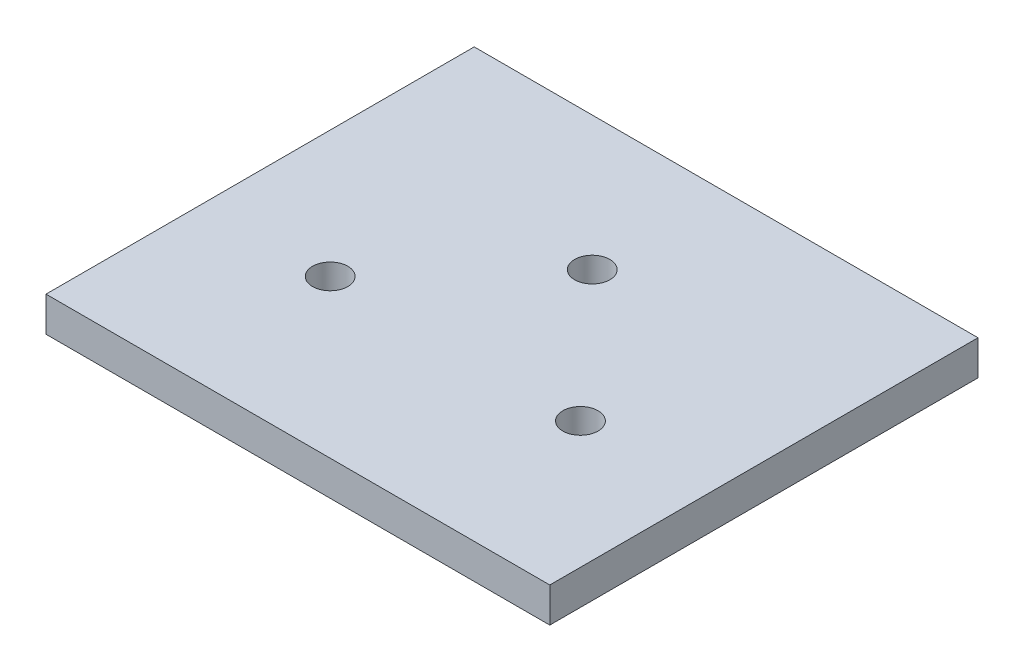
ISO-10303-21;
HEADER;
FILE_DESCRIPTION(('STEP AP214'),'2;1');
FILE_NAME('part.step','',(''),(''),'','','');
FILE_SCHEMA(('AUTOMOTIVE_DESIGN { 1 0 10303 214 1 1 1 1 }'));
ENDSEC;
DATA;
#1=APPLICATION_CONTEXT('core data for automotive mechanical design processes');
#2=APPLICATION_PROTOCOL_DEFINITION('international standard','automotive_design',2000,#1);
#3=PRODUCT_CONTEXT('',#1,'mechanical');
#4=PRODUCT('Part','Part','',(#3));
#5=PRODUCT_RELATED_PRODUCT_CATEGORY('part','',(#4));
#6=PRODUCT_DEFINITION_FORMATION('','',#4);
#7=PRODUCT_DEFINITION_CONTEXT('part definition',#1,'design');
#8=PRODUCT_DEFINITION('design','',#6,#7);
#9=PRODUCT_DEFINITION_SHAPE('','',#8);
#10=(LENGTH_UNIT() NAMED_UNIT(*) SI_UNIT(.MILLI.,.METRE.));
#11=(NAMED_UNIT(*) PLANE_ANGLE_UNIT() SI_UNIT($,.RADIAN.));
#12=(NAMED_UNIT(*) SI_UNIT($,.STERADIAN.) SOLID_ANGLE_UNIT());
#13=UNCERTAINTY_MEASURE_WITH_UNIT(LENGTH_MEASURE(1.E-05),#10,'distance_accuracy_value','');
#14=(GEOMETRIC_REPRESENTATION_CONTEXT(3) GLOBAL_UNCERTAINTY_ASSIGNED_CONTEXT((#13)) GLOBAL_UNIT_ASSIGNED_CONTEXT((#10,
#11,#12)) REPRESENTATION_CONTEXT('',''));
#15=CARTESIAN_POINT('',(0.,0.,0.));
#16=DIRECTION('',(0.,0.,1.));
#17=DIRECTION('',(1.,0.,0.));
#18=AXIS2_PLACEMENT_3D('',#15,#16,#17);
#19=CARTESIAN_POINT('',(0.,6.9,0.));
#20=DIRECTION('',(0.,-1.,0.));
#21=DIRECTION('',(0.,0.,-1.));
#22=AXIS2_PLACEMENT_3D('',#19,#20,#21);
#23=PLANE('',#22);
#24=DIRECTION('',(0.,0.,1.));
#25=VECTOR('',#24,1.);
#26=CARTESIAN_POINT('',(-50.,6.9,0.));
#27=LINE('',#26,#25);
#28=CARTESIAN_POINT('',(-50.,6.9,-85.));
#29=VERTEX_POINT('',#28);
#30=CARTESIAN_POINT('',(-50.,6.9,0.));
#31=VERTEX_POINT('',#30);
#32=EDGE_CURVE('E98',#29,#31,#27,.T.);
#33=ORIENTED_EDGE('',*,*,#32,.T.);
#34=DIRECTION('',(1.,0.,0.));
#35=VECTOR('',#34,1.);
#36=CARTESIAN_POINT('',(50.,6.9,0.));
#37=LINE('',#36,#35);
#38=CARTESIAN_POINT('',(50.,6.9,0.));
#39=VERTEX_POINT('',#38);
#40=EDGE_CURVE('E93',#31,#39,#37,.T.);
#41=ORIENTED_EDGE('',*,*,#40,.T.);
#42=DIRECTION('',(0.,0.,-1.));
#43=VECTOR('',#42,1.);
#44=CARTESIAN_POINT('',(50.,6.9,0.));
#45=LINE('',#44,#43);
#46=CARTESIAN_POINT('',(50.,6.9,-85.));
#47=VERTEX_POINT('',#46);
#48=EDGE_CURVE('E96',#39,#47,#45,.T.);
#49=ORIENTED_EDGE('',*,*,#48,.T.);
#50=DIRECTION('',(-1.,0.,0.));
#51=VECTOR('',#50,1.);
#52=CARTESIAN_POINT('',(-50.,6.9,-85.));
#53=LINE('',#52,#51);
#54=EDGE_CURVE('E63',#47,#29,#53,.T.);
#55=ORIENTED_EDGE('',*,*,#54,.T.);
#56=EDGE_LOOP('',(#33,#41,#49,#55));
#57=FACE_BOUND('',#56,.T.);
#58=CARTESIAN_POINT('',(0.,6.9,-58.4291717063436));
#59=DIRECTION('',(0.,1.,0.));
#60=DIRECTION('',(0.,0.,1.));
#61=AXIS2_PLACEMENT_3D('',#58,#59,#60);
#62=CIRCLE('',#61,3.5);
#63=CARTESIAN_POINT('',(0.,6.9,-61.9291717063436));
#64=VERTEX_POINT('',#63);
#65=EDGE_CURVE('E118',#64,#64,#62,.T.);
#66=ORIENTED_EDGE('',*,*,#65,.F.);
#67=EDGE_LOOP('',(#66));
#68=FACE_BOUND('',#67,.T.);
#69=CARTESIAN_POINT('',(24.8395858531718,6.9,-31.25));
#70=DIRECTION('',(0.,1.,0.));
#71=DIRECTION('',(0.,0.,1.));
#72=AXIS2_PLACEMENT_3D('',#69,#70,#71);
#73=CIRCLE('',#72,3.5);
#74=CARTESIAN_POINT('',(24.8395858531718,6.9,-34.75));
#75=VERTEX_POINT('',#74);
#76=EDGE_CURVE('E140',#75,#75,#73,.T.);
#77=ORIENTED_EDGE('',*,*,#76,.F.);
#78=EDGE_LOOP('',(#77));
#79=FACE_BOUND('',#78,.T.);
#80=CARTESIAN_POINT('',(-24.8395858531718,6.9,-31.25));
#81=DIRECTION('',(0.,1.,0.));
#82=DIRECTION('',(0.,0.,1.));
#83=AXIS2_PLACEMENT_3D('',#80,#81,#82);
#84=CIRCLE('',#83,3.5);
#85=CARTESIAN_POINT('',(-24.8395858531718,6.9,-34.75));
#86=VERTEX_POINT('',#85);
#87=EDGE_CURVE('E148',#86,#86,#84,.T.);
#88=ORIENTED_EDGE('',*,*,#87,.F.);
#89=EDGE_LOOP('',(#88));
#90=FACE_BOUND('',#89,.T.);
#91=ADVANCED_FACE('F45',(#57,#68,#79,#90),#23,.F.);
#92=CARTESIAN_POINT('',(0.,0.,0.));
#93=DIRECTION('',(0.,-1.,0.));
#94=DIRECTION('',(0.,0.,-1.));
#95=AXIS2_PLACEMENT_3D('',#92,#93,#94);
#96=PLANE('',#95);
#97=CARTESIAN_POINT('',(24.8395858531718,0.,-31.25));
#98=DIRECTION('',(0.,1.,0.));
#99=DIRECTION('',(0.,0.,1.));
#100=AXIS2_PLACEMENT_3D('',#97,#98,#99);
#101=CIRCLE('',#100,3.5);
#102=CARTESIAN_POINT('',(24.8395858531718,0.,-34.75));
#103=VERTEX_POINT('',#102);
#104=EDGE_CURVE('E144',#103,#103,#101,.T.);
#105=ORIENTED_EDGE('',*,*,#104,.T.);
#106=EDGE_LOOP('',(#105));
#107=FACE_BOUND('',#106,.T.);
#108=DIRECTION('',(0.,0.,1.));
#109=VECTOR('',#108,1.);
#110=CARTESIAN_POINT('',(-50.,0.,0.));
#111=LINE('',#110,#109);
#112=CARTESIAN_POINT('',(-50.,0.,-85.));
#113=VERTEX_POINT('',#112);
#114=CARTESIAN_POINT('',(-50.,0.,0.));
#115=VERTEX_POINT('',#114);
#116=EDGE_CURVE('E114',#113,#115,#111,.T.);
#117=ORIENTED_EDGE('',*,*,#116,.F.);
#118=DIRECTION('',(-1.,0.,0.));
#119=VECTOR('',#118,1.);
#120=CARTESIAN_POINT('',(-50.,0.,-85.));
#121=LINE('',#120,#119);
#122=CARTESIAN_POINT('',(50.,0.,-85.));
#123=VERTEX_POINT('',#122);
#124=EDGE_CURVE('E86',#123,#113,#121,.T.);
#125=ORIENTED_EDGE('',*,*,#124,.F.);
#126=DIRECTION('',(0.,0.,-1.));
#127=VECTOR('',#126,1.);
#128=CARTESIAN_POINT('',(50.,0.,0.));
#129=LINE('',#128,#127);
#130=CARTESIAN_POINT('',(50.,0.,0.));
#131=VERTEX_POINT('',#130);
#132=EDGE_CURVE('E80',#131,#123,#129,.T.);
#133=ORIENTED_EDGE('',*,*,#132,.F.);
#134=DIRECTION('',(1.,0.,0.));
#135=VECTOR('',#134,1.);
#136=CARTESIAN_POINT('',(50.,0.,0.));
#137=LINE('',#136,#135);
#138=EDGE_CURVE('E103',#115,#131,#137,.T.);
#139=ORIENTED_EDGE('',*,*,#138,.F.);
#140=EDGE_LOOP('',(#117,#125,#133,#139));
#141=FACE_BOUND('',#140,.T.);
#142=CARTESIAN_POINT('',(0.,0.,-58.4291717063436));
#143=DIRECTION('',(0.,1.,0.));
#144=DIRECTION('',(0.,0.,1.));
#145=AXIS2_PLACEMENT_3D('',#142,#143,#144);
#146=CIRCLE('',#145,3.5);
#147=CARTESIAN_POINT('',(0.,0.,-61.9291717063436));
#148=VERTEX_POINT('',#147);
#149=EDGE_CURVE('E136',#148,#148,#146,.T.);
#150=ORIENTED_EDGE('',*,*,#149,.T.);
#151=EDGE_LOOP('',(#150));
#152=FACE_BOUND('',#151,.T.);
#153=CARTESIAN_POINT('',(-24.8395858531718,0.,-31.25));
#154=DIRECTION('',(0.,1.,0.));
#155=DIRECTION('',(0.,0.,1.));
#156=AXIS2_PLACEMENT_3D('',#153,#154,#155);
#157=CIRCLE('',#156,3.5);
#158=CARTESIAN_POINT('',(-24.8395858531718,0.,-34.75));
#159=VERTEX_POINT('',#158);
#160=EDGE_CURVE('E152',#159,#159,#157,.T.);
#161=ORIENTED_EDGE('',*,*,#160,.T.);
#162=EDGE_LOOP('',(#161));
#163=FACE_BOUND('',#162,.T.);
#164=ADVANCED_FACE('F131',(#107,#141,#152,#163),#96,.T.);
#165=CARTESIAN_POINT('',(-50.,6.9,0.));
#166=DIRECTION('',(1.,0.,0.));
#167=DIRECTION('',(0.,0.,-1.));
#168=AXIS2_PLACEMENT_3D('',#165,#166,#167);
#169=PLANE('',#168);
#170=ORIENTED_EDGE('',*,*,#116,.T.);
#171=DIRECTION('',(0.,-1.,0.));
#172=VECTOR('',#171,1.);
#173=CARTESIAN_POINT('',(-50.,6.9,0.));
#174=LINE('',#173,#172);
#175=EDGE_CURVE('E11',#31,#115,#174,.T.);
#176=ORIENTED_EDGE('',*,*,#175,.F.);
#177=ORIENTED_EDGE('',*,*,#32,.F.);
#178=DIRECTION('',(0.,-1.,0.));
#179=VECTOR('',#178,1.);
#180=CARTESIAN_POINT('',(-50.,6.9,-85.));
#181=LINE('',#180,#179);
#182=EDGE_CURVE('E110',#29,#113,#181,.T.);
#183=ORIENTED_EDGE('',*,*,#182,.T.);
#184=EDGE_LOOP('',(#170,#176,#177,#183));
#185=FACE_BOUND('',#184,.T.);
#186=ADVANCED_FACE('F47',(#185),#169,.F.);
#187=CARTESIAN_POINT('',(50.,6.9,0.));
#188=DIRECTION('',(0.,0.,-1.));
#189=DIRECTION('',(-1.,0.,0.));
#190=AXIS2_PLACEMENT_3D('',#187,#188,#189);
#191=PLANE('',#190);
#192=ORIENTED_EDGE('',*,*,#138,.T.);
#193=DIRECTION('',(0.,-1.,0.));
#194=VECTOR('',#193,1.);
#195=CARTESIAN_POINT('',(50.,6.9,0.));
#196=LINE('',#195,#194);
#197=EDGE_CURVE('E55',#39,#131,#196,.T.);
#198=ORIENTED_EDGE('',*,*,#197,.F.);
#199=ORIENTED_EDGE('',*,*,#40,.F.);
#200=ORIENTED_EDGE('',*,*,#175,.T.);
#201=EDGE_LOOP('',(#192,#198,#199,#200));
#202=FACE_BOUND('',#201,.T.);
#203=ADVANCED_FACE('F102',(#202),#191,.F.);
#204=CARTESIAN_POINT('',(50.,6.9,0.));
#205=DIRECTION('',(-1.,0.,0.));
#206=DIRECTION('',(0.,0.,1.));
#207=AXIS2_PLACEMENT_3D('',#204,#205,#206);
#208=PLANE('',#207);
#209=ORIENTED_EDGE('',*,*,#132,.T.);
#210=DIRECTION('',(0.,-1.,0.));
#211=VECTOR('',#210,1.);
#212=CARTESIAN_POINT('',(50.,6.9,-85.));
#213=LINE('',#212,#211);
#214=EDGE_CURVE('E105',#47,#123,#213,.T.);
#215=ORIENTED_EDGE('',*,*,#214,.F.);
#216=ORIENTED_EDGE('',*,*,#48,.F.);
#217=ORIENTED_EDGE('',*,*,#197,.T.);
#218=EDGE_LOOP('',(#209,#215,#216,#217));
#219=FACE_BOUND('',#218,.T.);
#220=ADVANCED_FACE('F106',(#219),#208,.F.);
#221=CARTESIAN_POINT('',(-50.,6.9,-85.));
#222=DIRECTION('',(0.,0.,1.));
#223=DIRECTION('',(1.,0.,0.));
#224=AXIS2_PLACEMENT_3D('',#221,#222,#223);
#225=PLANE('',#224);
#226=ORIENTED_EDGE('',*,*,#124,.T.);
#227=ORIENTED_EDGE('',*,*,#182,.F.);
#228=ORIENTED_EDGE('',*,*,#54,.F.);
#229=ORIENTED_EDGE('',*,*,#214,.T.);
#230=EDGE_LOOP('',(#226,#227,#228,#229));
#231=FACE_BOUND('',#230,.T.);
#232=ADVANCED_FACE('F128',(#231),#225,.F.);
#233=CARTESIAN_POINT('',(0.,6.9,-58.4291717063436));
#234=DIRECTION('',(0.,-1.,0.));
#235=DIRECTION('',(0.,0.,-1.));
#236=AXIS2_PLACEMENT_3D('',#233,#234,#235);
#237=CYLINDRICAL_SURFACE('',#236,3.5);
#238=CARTESIAN_POINT('',(0.,6.9,-61.9291717063436));
#239=CARTESIAN_POINT('',(0.,6.828125,-61.9291717063436));
#240=CARTESIAN_POINT('',(0.,6.75625,-61.9291717063436));
#241=CARTESIAN_POINT('',(0.,6.6125,-61.9291717063436));
#242=CARTESIAN_POINT('',(0.,6.540625,-61.9291717063436));
#243=CARTESIAN_POINT('',(0.,6.396875,-61.9291717063436));
#244=CARTESIAN_POINT('',(0.,6.325,-61.9291717063436));
#245=CARTESIAN_POINT('',(0.,6.18125,-61.9291717063436));
#246=CARTESIAN_POINT('',(0.,6.109375,-61.9291717063436));
#247=CARTESIAN_POINT('',(0.,5.965625,-61.9291717063436));
#248=CARTESIAN_POINT('',(0.,5.89375,-61.9291717063436));
#249=CARTESIAN_POINT('',(0.,5.75,-61.9291717063436));
#250=CARTESIAN_POINT('',(0.,5.678125,-61.9291717063436));
#251=CARTESIAN_POINT('',(0.,5.534375,-61.9291717063436));
#252=CARTESIAN_POINT('',(0.,5.4625,-61.9291717063436));
#253=CARTESIAN_POINT('',(0.,5.31875,-61.9291717063436));
#254=CARTESIAN_POINT('',(0.,5.246875,-61.9291717063436));
#255=CARTESIAN_POINT('',(0.,5.103125,-61.9291717063436));
#256=CARTESIAN_POINT('',(0.,5.03125,-61.9291717063436));
#257=CARTESIAN_POINT('',(0.,4.8875,-61.9291717063436));
#258=CARTESIAN_POINT('',(0.,4.815625,-61.9291717063436));
#259=CARTESIAN_POINT('',(0.,4.671875,-61.9291717063436));
#260=CARTESIAN_POINT('',(0.,4.6,-61.9291717063436));
#261=CARTESIAN_POINT('',(0.,4.45625,-61.9291717063436));
#262=CARTESIAN_POINT('',(0.,4.384375,-61.9291717063436));
#263=CARTESIAN_POINT('',(0.,4.240625,-61.9291717063436));
#264=CARTESIAN_POINT('',(0.,4.16875,-61.9291717063436));
#265=CARTESIAN_POINT('',(0.,4.025,-61.9291717063436));
#266=CARTESIAN_POINT('',(0.,3.953125,-61.9291717063436));
#267=CARTESIAN_POINT('',(0.,3.809375,-61.9291717063436));
#268=CARTESIAN_POINT('',(0.,3.7375,-61.9291717063436));
#269=CARTESIAN_POINT('',(0.,3.59375,-61.9291717063436));
#270=CARTESIAN_POINT('',(0.,3.521875,-61.9291717063436));
#271=CARTESIAN_POINT('',(0.,3.378125,-61.9291717063436));
#272=CARTESIAN_POINT('',(0.,3.30625,-61.9291717063436));
#273=CARTESIAN_POINT('',(0.,3.1625,-61.9291717063436));
#274=CARTESIAN_POINT('',(0.,3.090625,-61.9291717063436));
#275=CARTESIAN_POINT('',(0.,2.946875,-61.9291717063436));
#276=CARTESIAN_POINT('',(0.,2.875,-61.9291717063436));
#277=CARTESIAN_POINT('',(0.,2.73125,-61.9291717063436));
#278=CARTESIAN_POINT('',(0.,2.659375,-61.9291717063436));
#279=CARTESIAN_POINT('',(0.,2.515625,-61.9291717063436));
#280=CARTESIAN_POINT('',(0.,2.44375,-61.9291717063436));
#281=CARTESIAN_POINT('',(0.,2.3,-61.9291717063436));
#282=CARTESIAN_POINT('',(0.,2.228125,-61.9291717063436));
#283=CARTESIAN_POINT('',(0.,2.084375,-61.9291717063436));
#284=CARTESIAN_POINT('',(0.,2.0125,-61.9291717063436));
#285=CARTESIAN_POINT('',(0.,1.86875,-61.9291717063436));
#286=CARTESIAN_POINT('',(0.,1.796875,-61.9291717063436));
#287=CARTESIAN_POINT('',(0.,1.653125,-61.9291717063436));
#288=CARTESIAN_POINT('',(0.,1.58125,-61.9291717063436));
#289=CARTESIAN_POINT('',(0.,1.4375,-61.9291717063436));
#290=CARTESIAN_POINT('',(0.,1.365625,-61.9291717063436));
#291=CARTESIAN_POINT('',(0.,1.221875,-61.9291717063436));
#292=CARTESIAN_POINT('',(0.,1.15,-61.9291717063436));
#293=CARTESIAN_POINT('',(0.,1.00625,-61.9291717063436));
#294=CARTESIAN_POINT('',(0.,0.934375,-61.9291717063436));
#295=CARTESIAN_POINT('',(0.,0.790625,-61.9291717063436));
#296=CARTESIAN_POINT('',(0.,0.71875,-61.9291717063436));
#297=CARTESIAN_POINT('',(0.,0.575,-61.9291717063436));
#298=CARTESIAN_POINT('',(0.,0.503125,-61.9291717063436));
#299=CARTESIAN_POINT('',(0.,0.359375,-61.9291717063436));
#300=CARTESIAN_POINT('',(0.,0.2875,-61.9291717063436));
#301=CARTESIAN_POINT('',(0.,0.14375,-61.9291717063436));
#302=CARTESIAN_POINT('',(0.,0.0718749999999998,-61.9291717063436));
#303=CARTESIAN_POINT('',(0.,0.,-61.9291717063436));
#304=B_SPLINE_CURVE_WITH_KNOTS('',3,(#238,#239,#240,#241,#242,#243,#244,#245,#246,#247,#248,
#249,#250,#251,#252,#253,#254,#255,#256,#257,#258,#259,#260,#261,#262,#263,#264,#265,#266,#267,
#268,#269,#270,#271,#272,#273,#274,#275,#276,#277,#278,#279,#280,#281,#282,#283,#284,#285,#286,
#287,#288,#289,#290,#291,#292,#293,#294,#295,#296,#297,#298,#299,#300,#301,#302,#303),
.UNSPECIFIED.,.F.,.F.,(4,2,2,2,2,2,2,2,2,2,2,2,2,2,2,2,2,2,2,2,2,2,2,2,2,2,2,2,2,2,2,2,4),(0.,
0.215625,0.431249999999999,0.646875,0.8625,1.078125,1.29375,1.509375,1.725,1.940625,2.15625,
2.371875,2.5875,2.803125,3.01875,3.234375,3.45,3.665625,3.88125,4.096875,4.3125,4.528125,
4.74375,4.959375,5.175,5.390625,5.60625,5.821875,6.0375,6.253125,6.46875,6.684375,6.9),.UNSPECIFIED.);
#305=EDGE_CURVE('BSEAM171',#64,#148,#304,.T.);
#306=ORIENTED_EDGE('',*,*,#65,.T.);
#307=ORIENTED_EDGE('',*,*,#149,.F.);
#308=ORIENTED_EDGE('',*,*,#305,.T.);
#309=ORIENTED_EDGE('',*,*,#305,.F.);
#310=EDGE_LOOP('',(#306,#308,#307,#309));
#311=FACE_BOUND('',#310,.T.);
#312=ADVANCED_FACE('F171',(#311),#237,.F.);
#313=CARTESIAN_POINT('',(24.8395858531718,6.9,-31.25));
#314=DIRECTION('',(0.,-1.,0.));
#315=DIRECTION('',(0.,0.,-1.));
#316=AXIS2_PLACEMENT_3D('',#313,#314,#315);
#317=CYLINDRICAL_SURFACE('',#316,3.5);
#318=CARTESIAN_POINT('',(24.8395858531718,6.9,-34.75));
#319=CARTESIAN_POINT('',(24.8395858531718,6.828125,-34.75));
#320=CARTESIAN_POINT('',(24.8395858531718,6.75625,-34.75));
#321=CARTESIAN_POINT('',(24.8395858531718,6.6125,-34.75));
#322=CARTESIAN_POINT('',(24.8395858531718,6.540625,-34.75));
#323=CARTESIAN_POINT('',(24.8395858531718,6.396875,-34.75));
#324=CARTESIAN_POINT('',(24.8395858531718,6.325,-34.75));
#325=CARTESIAN_POINT('',(24.8395858531718,6.18125,-34.75));
#326=CARTESIAN_POINT('',(24.8395858531718,6.109375,-34.75));
#327=CARTESIAN_POINT('',(24.8395858531718,5.965625,-34.75));
#328=CARTESIAN_POINT('',(24.8395858531718,5.89375,-34.75));
#329=CARTESIAN_POINT('',(24.8395858531718,5.75,-34.75));
#330=CARTESIAN_POINT('',(24.8395858531718,5.678125,-34.75));
#331=CARTESIAN_POINT('',(24.8395858531718,5.534375,-34.75));
#332=CARTESIAN_POINT('',(24.8395858531718,5.4625,-34.75));
#333=CARTESIAN_POINT('',(24.8395858531718,5.31875,-34.75));
#334=CARTESIAN_POINT('',(24.8395858531718,5.246875,-34.75));
#335=CARTESIAN_POINT('',(24.8395858531718,5.103125,-34.75));
#336=CARTESIAN_POINT('',(24.8395858531718,5.03125,-34.75));
#337=CARTESIAN_POINT('',(24.8395858531718,4.8875,-34.75));
#338=CARTESIAN_POINT('',(24.8395858531718,4.815625,-34.75));
#339=CARTESIAN_POINT('',(24.8395858531718,4.671875,-34.75));
#340=CARTESIAN_POINT('',(24.8395858531718,4.6,-34.75));
#341=CARTESIAN_POINT('',(24.8395858531718,4.45625,-34.75));
#342=CARTESIAN_POINT('',(24.8395858531718,4.384375,-34.75));
#343=CARTESIAN_POINT('',(24.8395858531718,4.240625,-34.75));
#344=CARTESIAN_POINT('',(24.8395858531718,4.16875,-34.75));
#345=CARTESIAN_POINT('',(24.8395858531718,4.025,-34.75));
#346=CARTESIAN_POINT('',(24.8395858531718,3.953125,-34.75));
#347=CARTESIAN_POINT('',(24.8395858531718,3.809375,-34.75));
#348=CARTESIAN_POINT('',(24.8395858531718,3.7375,-34.75));
#349=CARTESIAN_POINT('',(24.8395858531718,3.59375,-34.75));
#350=CARTESIAN_POINT('',(24.8395858531718,3.521875,-34.75));
#351=CARTESIAN_POINT('',(24.8395858531718,3.378125,-34.75));
#352=CARTESIAN_POINT('',(24.8395858531718,3.30625,-34.75));
#353=CARTESIAN_POINT('',(24.8395858531718,3.1625,-34.75));
#354=CARTESIAN_POINT('',(24.8395858531718,3.090625,-34.75));
#355=CARTESIAN_POINT('',(24.8395858531718,2.946875,-34.75));
#356=CARTESIAN_POINT('',(24.8395858531718,2.875,-34.75));
#357=CARTESIAN_POINT('',(24.8395858531718,2.73125,-34.75));
#358=CARTESIAN_POINT('',(24.8395858531718,2.659375,-34.75));
#359=CARTESIAN_POINT('',(24.8395858531718,2.515625,-34.75));
#360=CARTESIAN_POINT('',(24.8395858531718,2.44375,-34.75));
#361=CARTESIAN_POINT('',(24.8395858531718,2.3,-34.75));
#362=CARTESIAN_POINT('',(24.8395858531718,2.228125,-34.75));
#363=CARTESIAN_POINT('',(24.8395858531718,2.084375,-34.75));
#364=CARTESIAN_POINT('',(24.8395858531718,2.0125,-34.75));
#365=CARTESIAN_POINT('',(24.8395858531718,1.86875,-34.75));
#366=CARTESIAN_POINT('',(24.8395858531718,1.796875,-34.75));
#367=CARTESIAN_POINT('',(24.8395858531718,1.653125,-34.75));
#368=CARTESIAN_POINT('',(24.8395858531718,1.58125,-34.75));
#369=CARTESIAN_POINT('',(24.8395858531718,1.4375,-34.75));
#370=CARTESIAN_POINT('',(24.8395858531718,1.365625,-34.75));
#371=CARTESIAN_POINT('',(24.8395858531718,1.221875,-34.75));
#372=CARTESIAN_POINT('',(24.8395858531718,1.15,-34.75));
#373=CARTESIAN_POINT('',(24.8395858531718,1.00625,-34.75));
#374=CARTESIAN_POINT('',(24.8395858531718,0.934375,-34.75));
#375=CARTESIAN_POINT('',(24.8395858531718,0.790625,-34.75));
#376=CARTESIAN_POINT('',(24.8395858531718,0.71875,-34.75));
#377=CARTESIAN_POINT('',(24.8395858531718,0.575,-34.75));
#378=CARTESIAN_POINT('',(24.8395858531718,0.503125,-34.75));
#379=CARTESIAN_POINT('',(24.8395858531718,0.359375,-34.75));
#380=CARTESIAN_POINT('',(24.8395858531718,0.2875,-34.75));
#381=CARTESIAN_POINT('',(24.8395858531718,0.14375,-34.75));
#382=CARTESIAN_POINT('',(24.8395858531718,0.0718749999999998,-34.75));
#383=CARTESIAN_POINT('',(24.8395858531718,0.,-34.75));
#384=B_SPLINE_CURVE_WITH_KNOTS('',3,(#318,#319,#320,#321,#322,#323,#324,#325,#326,#327,#328,
#329,#330,#331,#332,#333,#334,#335,#336,#337,#338,#339,#340,#341,#342,#343,#344,#345,#346,#347,
#348,#349,#350,#351,#352,#353,#354,#355,#356,#357,#358,#359,#360,#361,#362,#363,#364,#365,#366,
#367,#368,#369,#370,#371,#372,#373,#374,#375,#376,#377,#378,#379,#380,#381,#382,#383),
.UNSPECIFIED.,.F.,.F.,(4,2,2,2,2,2,2,2,2,2,2,2,2,2,2,2,2,2,2,2,2,2,2,2,2,2,2,2,2,2,2,2,4),(0.,
0.215625,0.431249999999999,0.646875,0.8625,1.078125,1.29375,1.509375,1.725,1.940625,2.15625,
2.371875,2.5875,2.803125,3.01875,3.234375,3.45,3.665625,3.88125,4.096875,4.3125,4.528125,
4.74375,4.959375,5.175,5.390625,5.60625,5.821875,6.0375,6.253125,6.46875,6.684375,6.9),.UNSPECIFIED.);
#385=EDGE_CURVE('BSEAM216',#75,#103,#384,.T.);
#386=ORIENTED_EDGE('',*,*,#76,.T.);
#387=ORIENTED_EDGE('',*,*,#104,.F.);
#388=ORIENTED_EDGE('',*,*,#385,.T.);
#389=ORIENTED_EDGE('',*,*,#385,.F.);
#390=EDGE_LOOP('',(#386,#388,#387,#389));
#391=FACE_BOUND('',#390,.T.);
#392=ADVANCED_FACE('F216',(#391),#317,.F.);
#393=CARTESIAN_POINT('',(-24.8395858531718,6.9,-31.25));
#394=DIRECTION('',(0.,-1.,0.));
#395=DIRECTION('',(0.,0.,-1.));
#396=AXIS2_PLACEMENT_3D('',#393,#394,#395);
#397=CYLINDRICAL_SURFACE('',#396,3.5);
#398=CARTESIAN_POINT('',(-24.8395858531718,6.9,-34.75));
#399=CARTESIAN_POINT('',(-24.8395858531718,6.828125,-34.75));
#400=CARTESIAN_POINT('',(-24.8395858531718,6.75625,-34.75));
#401=CARTESIAN_POINT('',(-24.8395858531718,6.6125,-34.75));
#402=CARTESIAN_POINT('',(-24.8395858531718,6.540625,-34.75));
#403=CARTESIAN_POINT('',(-24.8395858531718,6.396875,-34.75));
#404=CARTESIAN_POINT('',(-24.8395858531718,6.325,-34.75));
#405=CARTESIAN_POINT('',(-24.8395858531718,6.18125,-34.75));
#406=CARTESIAN_POINT('',(-24.8395858531718,6.109375,-34.75));
#407=CARTESIAN_POINT('',(-24.8395858531718,5.965625,-34.75));
#408=CARTESIAN_POINT('',(-24.8395858531718,5.89375,-34.75));
#409=CARTESIAN_POINT('',(-24.8395858531718,5.75,-34.75));
#410=CARTESIAN_POINT('',(-24.8395858531718,5.678125,-34.75));
#411=CARTESIAN_POINT('',(-24.8395858531718,5.534375,-34.75));
#412=CARTESIAN_POINT('',(-24.8395858531718,5.4625,-34.75));
#413=CARTESIAN_POINT('',(-24.8395858531718,5.31875,-34.75));
#414=CARTESIAN_POINT('',(-24.8395858531718,5.246875,-34.75));
#415=CARTESIAN_POINT('',(-24.8395858531718,5.103125,-34.75));
#416=CARTESIAN_POINT('',(-24.8395858531718,5.03125,-34.75));
#417=CARTESIAN_POINT('',(-24.8395858531718,4.8875,-34.75));
#418=CARTESIAN_POINT('',(-24.8395858531718,4.815625,-34.75));
#419=CARTESIAN_POINT('',(-24.8395858531718,4.671875,-34.75));
#420=CARTESIAN_POINT('',(-24.8395858531718,4.6,-34.75));
#421=CARTESIAN_POINT('',(-24.8395858531718,4.45625,-34.75));
#422=CARTESIAN_POINT('',(-24.8395858531718,4.384375,-34.75));
#423=CARTESIAN_POINT('',(-24.8395858531718,4.240625,-34.75));
#424=CARTESIAN_POINT('',(-24.8395858531718,4.16875,-34.75));
#425=CARTESIAN_POINT('',(-24.8395858531718,4.025,-34.75));
#426=CARTESIAN_POINT('',(-24.8395858531718,3.953125,-34.75));
#427=CARTESIAN_POINT('',(-24.8395858531718,3.809375,-34.75));
#428=CARTESIAN_POINT('',(-24.8395858531718,3.7375,-34.75));
#429=CARTESIAN_POINT('',(-24.8395858531718,3.59375,-34.75));
#430=CARTESIAN_POINT('',(-24.8395858531718,3.521875,-34.75));
#431=CARTESIAN_POINT('',(-24.8395858531718,3.378125,-34.75));
#432=CARTESIAN_POINT('',(-24.8395858531718,3.30625,-34.75));
#433=CARTESIAN_POINT('',(-24.8395858531718,3.1625,-34.75));
#434=CARTESIAN_POINT('',(-24.8395858531718,3.090625,-34.75));
#435=CARTESIAN_POINT('',(-24.8395858531718,2.946875,-34.75));
#436=CARTESIAN_POINT('',(-24.8395858531718,2.875,-34.75));
#437=CARTESIAN_POINT('',(-24.8395858531718,2.73125,-34.75));
#438=CARTESIAN_POINT('',(-24.8395858531718,2.659375,-34.75));
#439=CARTESIAN_POINT('',(-24.8395858531718,2.515625,-34.75));
#440=CARTESIAN_POINT('',(-24.8395858531718,2.44375,-34.75));
#441=CARTESIAN_POINT('',(-24.8395858531718,2.3,-34.75));
#442=CARTESIAN_POINT('',(-24.8395858531718,2.228125,-34.75));
#443=CARTESIAN_POINT('',(-24.8395858531718,2.084375,-34.75));
#444=CARTESIAN_POINT('',(-24.8395858531718,2.0125,-34.75));
#445=CARTESIAN_POINT('',(-24.8395858531718,1.86875,-34.75));
#446=CARTESIAN_POINT('',(-24.8395858531718,1.796875,-34.75));
#447=CARTESIAN_POINT('',(-24.8395858531718,1.653125,-34.75));
#448=CARTESIAN_POINT('',(-24.8395858531718,1.58125,-34.75));
#449=CARTESIAN_POINT('',(-24.8395858531718,1.4375,-34.75));
#450=CARTESIAN_POINT('',(-24.8395858531718,1.365625,-34.75));
#451=CARTESIAN_POINT('',(-24.8395858531718,1.221875,-34.75));
#452=CARTESIAN_POINT('',(-24.8395858531718,1.15,-34.75));
#453=CARTESIAN_POINT('',(-24.8395858531718,1.00625,-34.75));
#454=CARTESIAN_POINT('',(-24.8395858531718,0.934375,-34.75));
#455=CARTESIAN_POINT('',(-24.8395858531718,0.790625,-34.75));
#456=CARTESIAN_POINT('',(-24.8395858531718,0.71875,-34.75));
#457=CARTESIAN_POINT('',(-24.8395858531718,0.575,-34.75));
#458=CARTESIAN_POINT('',(-24.8395858531718,0.503125,-34.75));
#459=CARTESIAN_POINT('',(-24.8395858531718,0.359375,-34.75));
#460=CARTESIAN_POINT('',(-24.8395858531718,0.2875,-34.75));
#461=CARTESIAN_POINT('',(-24.8395858531718,0.14375,-34.75));
#462=CARTESIAN_POINT('',(-24.8395858531718,0.0718749999999998,-34.75));
#463=CARTESIAN_POINT('',(-24.8395858531718,0.,-34.75));
#464=B_SPLINE_CURVE_WITH_KNOTS('',3,(#398,#399,#400,#401,#402,#403,#404,#405,#406,#407,#408,
#409,#410,#411,#412,#413,#414,#415,#416,#417,#418,#419,#420,#421,#422,#423,#424,#425,#426,#427,
#428,#429,#430,#431,#432,#433,#434,#435,#436,#437,#438,#439,#440,#441,#442,#443,#444,#445,#446,
#447,#448,#449,#450,#451,#452,#453,#454,#455,#456,#457,#458,#459,#460,#461,#462,#463),
.UNSPECIFIED.,.F.,.F.,(4,2,2,2,2,2,2,2,2,2,2,2,2,2,2,2,2,2,2,2,2,2,2,2,2,2,2,2,2,2,2,2,4),(0.,
0.215625,0.431249999999999,0.646875,0.8625,1.078125,1.29375,1.509375,1.725,1.940625,2.15625,
2.371875,2.5875,2.803125,3.01875,3.234375,3.45,3.665625,3.88125,4.096875,4.3125,4.528125,
4.74375,4.959375,5.175,5.390625,5.60625,5.821875,6.0375,6.253125,6.46875,6.684375,6.9),.UNSPECIFIED.);
#465=EDGE_CURVE('BSEAM160',#86,#159,#464,.T.);
#466=ORIENTED_EDGE('',*,*,#87,.T.);
#467=ORIENTED_EDGE('',*,*,#160,.F.);
#468=ORIENTED_EDGE('',*,*,#465,.T.);
#469=ORIENTED_EDGE('',*,*,#465,.F.);
#470=EDGE_LOOP('',(#466,#468,#467,#469));
#471=FACE_BOUND('',#470,.T.);
#472=ADVANCED_FACE('F160',(#471),#397,.F.);
#473=CLOSED_SHELL('',(#91,#164,#186,#203,#220,#232,#312,#392,#472));
#474=MANIFOLD_SOLID_BREP('B2',#473);
#475=ADVANCED_BREP_SHAPE_REPRESENTATION('',(#18,#474),#14);
#476=SHAPE_DEFINITION_REPRESENTATION(#9,#475);
ENDSEC;
END-ISO-10303-21;
